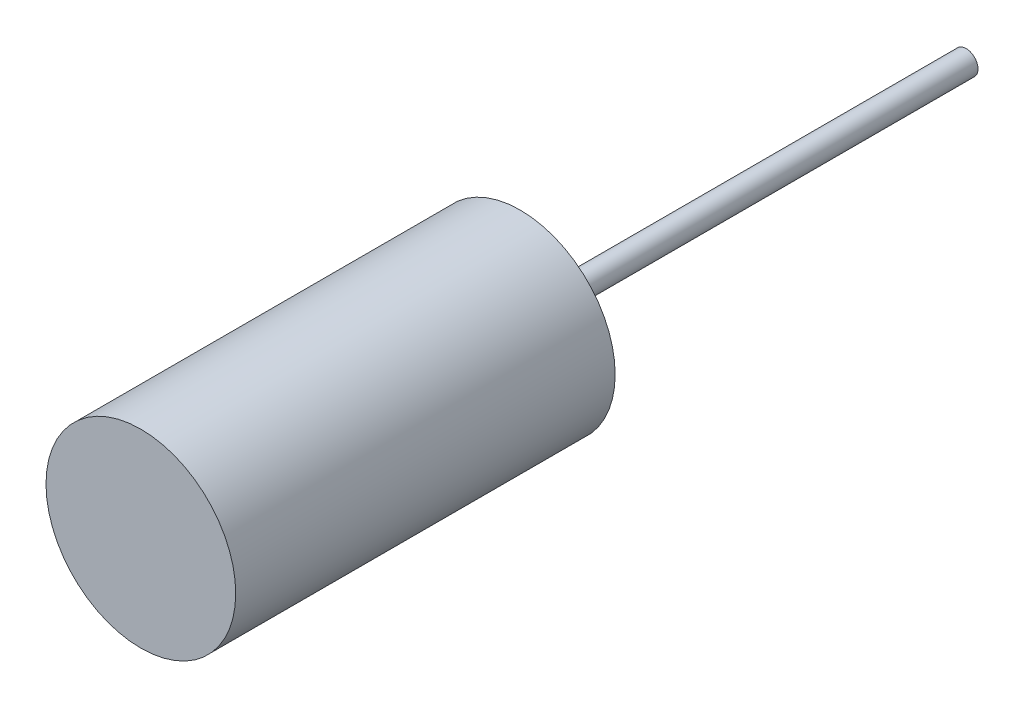
ISO-10303-21;
HEADER;
FILE_DESCRIPTION(('STEP AP214'),'2;1');
FILE_NAME('part.step','',(''),(''),'','','');
FILE_SCHEMA(('AUTOMOTIVE_DESIGN { 1 0 10303 214 1 1 1 1 }'));
ENDSEC;
DATA;
#1=APPLICATION_CONTEXT('core data for automotive mechanical design processes');
#2=APPLICATION_PROTOCOL_DEFINITION('international standard','automotive_design',2000,#1);
#3=PRODUCT_CONTEXT('',#1,'mechanical');
#4=PRODUCT('Part','Part','',(#3));
#5=PRODUCT_RELATED_PRODUCT_CATEGORY('part','',(#4));
#6=PRODUCT_DEFINITION_FORMATION('','',#4);
#7=PRODUCT_DEFINITION_CONTEXT('part definition',#1,'design');
#8=PRODUCT_DEFINITION('design','',#6,#7);
#9=PRODUCT_DEFINITION_SHAPE('','',#8);
#10=(LENGTH_UNIT() NAMED_UNIT(*) SI_UNIT(.MILLI.,.METRE.));
#11=(NAMED_UNIT(*) PLANE_ANGLE_UNIT() SI_UNIT($,.RADIAN.));
#12=(NAMED_UNIT(*) SI_UNIT($,.STERADIAN.) SOLID_ANGLE_UNIT());
#13=UNCERTAINTY_MEASURE_WITH_UNIT(LENGTH_MEASURE(1.E-05),#10,'distance_accuracy_value','');
#14=(GEOMETRIC_REPRESENTATION_CONTEXT(3) GLOBAL_UNCERTAINTY_ASSIGNED_CONTEXT((#13)) GLOBAL_UNIT_ASSIGNED_CONTEXT((#10,
#11,#12)) REPRESENTATION_CONTEXT('',''));
#15=CARTESIAN_POINT('',(0.,0.,0.));
#16=DIRECTION('',(0.,0.,1.));
#17=DIRECTION('',(1.,0.,0.));
#18=AXIS2_PLACEMENT_3D('',#15,#16,#17);
#19=CARTESIAN_POINT('',(0.,0.,50.7999999999999));
#20=DIRECTION('',(0.,0.,-0.999999999999989));
#21=DIRECTION('',(-0.999999999999996,0.,0.));
#22=AXIS2_PLACEMENT_3D('',#19,#20,#21);
#23=CYLINDRICAL_SURFACE('',#22,12.7);
#24=CARTESIAN_POINT('',(0.,0.,50.7999999999999));
#25=DIRECTION('',(0.,0.,0.999999999999989));
#26=DIRECTION('',(0.999999999999996,0.,0.));
#27=AXIS2_PLACEMENT_3D('',#24,#25,#26);
#28=CIRCLE('',#27,12.7);
#29=CARTESIAN_POINT('',(-12.6999999999999,0.,50.7999999999999));
#30=VERTEX_POINT('',#29);
#31=EDGE_CURVE('E62',#30,#30,#28,.T.);
#32=CARTESIAN_POINT('',(0.,0.,0.));
#33=DIRECTION('',(0.,0.,0.999999999999989));
#34=DIRECTION('',(0.999999999999996,0.,0.));
#35=AXIS2_PLACEMENT_3D('',#32,#33,#34);
#36=CIRCLE('',#35,12.7);
#37=CARTESIAN_POINT('',(-12.6999999999999,0.,0.));
#38=VERTEX_POINT('',#37);
#39=EDGE_CURVE('E120',#38,#38,#36,.T.);
#40=CARTESIAN_POINT('',(-12.6999999999999,0.,50.7999999999999));
#41=CARTESIAN_POINT('',(-12.6999999999999,0.,50.2708333333332));
#42=CARTESIAN_POINT('',(-12.6999999999999,0.,49.7416666666666));
#43=CARTESIAN_POINT('',(-12.6999999999999,0.,48.6833333333332));
#44=CARTESIAN_POINT('',(-12.6999999999999,0.,48.1541666666666));
#45=CARTESIAN_POINT('',(-12.6999999999999,0.,47.0958333333332));
#46=CARTESIAN_POINT('',(-12.6999999999999,0.,46.5666666666666));
#47=CARTESIAN_POINT('',(-12.6999999999999,0.,45.5083333333332));
#48=CARTESIAN_POINT('',(-12.6999999999999,0.,44.9791666666666));
#49=CARTESIAN_POINT('',(-12.6999999999999,0.,43.9208333333332));
#50=CARTESIAN_POINT('',(-12.6999999999999,0.,43.3916666666666));
#51=CARTESIAN_POINT('',(-12.6999999999999,0.,42.3333333333333));
#52=CARTESIAN_POINT('',(-12.6999999999999,0.,41.8041666666666));
#53=CARTESIAN_POINT('',(-12.6999999999999,0.,40.7458333333333));
#54=CARTESIAN_POINT('',(-12.6999999999999,0.,40.2166666666666));
#55=CARTESIAN_POINT('',(-12.6999999999999,0.,39.1583333333333));
#56=CARTESIAN_POINT('',(-12.6999999999999,0.,38.6291666666666));
#57=CARTESIAN_POINT('',(-12.6999999999999,0.,37.5708333333333));
#58=CARTESIAN_POINT('',(-12.6999999999999,0.,37.0416666666666));
#59=CARTESIAN_POINT('',(-12.6999999999999,0.,35.9833333333333));
#60=CARTESIAN_POINT('',(-12.6999999999999,0.,35.4541666666666));
#61=CARTESIAN_POINT('',(-12.6999999999999,0.,34.3958333333333));
#62=CARTESIAN_POINT('',(-12.6999999999999,0.,33.8666666666666));
#63=CARTESIAN_POINT('',(-12.6999999999999,0.,32.8083333333333));
#64=CARTESIAN_POINT('',(-12.6999999999999,0.,32.2791666666666));
#65=CARTESIAN_POINT('',(-12.6999999999999,0.,31.2208333333333));
#66=CARTESIAN_POINT('',(-12.6999999999999,0.,30.6916666666666));
#67=CARTESIAN_POINT('',(-12.6999999999999,0.,29.6333333333333));
#68=CARTESIAN_POINT('',(-12.6999999999999,0.,29.1041666666666));
#69=CARTESIAN_POINT('',(-12.6999999999999,0.,28.0458333333333));
#70=CARTESIAN_POINT('',(-12.6999999999999,0.,27.5166666666666));
#71=CARTESIAN_POINT('',(-12.6999999999999,0.,26.4583333333333));
#72=CARTESIAN_POINT('',(-12.6999999999999,0.,25.9291666666666));
#73=CARTESIAN_POINT('',(-12.6999999999999,0.,24.8708333333333));
#74=CARTESIAN_POINT('',(-12.6999999999999,0.,24.3416666666666));
#75=CARTESIAN_POINT('',(-12.6999999999999,0.,23.2833333333333));
#76=CARTESIAN_POINT('',(-12.6999999999999,0.,22.7541666666666));
#77=CARTESIAN_POINT('',(-12.6999999999999,0.,21.6958333333333));
#78=CARTESIAN_POINT('',(-12.6999999999999,0.,21.1666666666666));
#79=CARTESIAN_POINT('',(-12.6999999999999,0.,20.1083333333333));
#80=CARTESIAN_POINT('',(-12.6999999999999,0.,19.5791666666666));
#81=CARTESIAN_POINT('',(-12.6999999999999,0.,18.5208333333333));
#82=CARTESIAN_POINT('',(-12.6999999999999,0.,17.9916666666666));
#83=CARTESIAN_POINT('',(-12.6999999999999,0.,16.9333333333333));
#84=CARTESIAN_POINT('',(-12.6999999999999,0.,16.4041666666666));
#85=CARTESIAN_POINT('',(-12.6999999999999,0.,15.3458333333333));
#86=CARTESIAN_POINT('',(-12.6999999999999,0.,14.8166666666666));
#87=CARTESIAN_POINT('',(-12.6999999999999,0.,13.7583333333333));
#88=CARTESIAN_POINT('',(-12.6999999999999,0.,13.2291666666666));
#89=CARTESIAN_POINT('',(-12.6999999999999,0.,12.1708333333333));
#90=CARTESIAN_POINT('',(-12.6999999999999,0.,11.6416666666666));
#91=CARTESIAN_POINT('',(-12.6999999999999,0.,10.5833333333333));
#92=CARTESIAN_POINT('',(-12.6999999999999,0.,10.0541666666666));
#93=CARTESIAN_POINT('',(-12.6999999999999,0.,8.99583333333332));
#94=CARTESIAN_POINT('',(-12.6999999999999,0.,8.46666666666665));
#95=CARTESIAN_POINT('',(-12.6999999999999,0.,7.40833333333332));
#96=CARTESIAN_POINT('',(-12.6999999999999,0.,6.87916666666665));
#97=CARTESIAN_POINT('',(-12.6999999999999,0.,5.82083333333332));
#98=CARTESIAN_POINT('',(-12.6999999999999,0.,5.29166666666666));
#99=CARTESIAN_POINT('',(-12.6999999999999,0.,4.23333333333333));
#100=CARTESIAN_POINT('',(-12.6999999999999,0.,3.70416666666666));
#101=CARTESIAN_POINT('',(-12.6999999999999,0.,2.64583333333333));
#102=CARTESIAN_POINT('',(-12.6999999999999,0.,2.11666666666666));
#103=CARTESIAN_POINT('',(-12.6999999999999,0.,1.05833333333333));
#104=CARTESIAN_POINT('',(-12.6999999999999,0.,0.529166666666666));
#105=CARTESIAN_POINT('',(-12.6999999999999,0.,0.));
#106=B_SPLINE_CURVE_WITH_KNOTS('',3,(#40,#41,#42,#43,#44,#45,#46,#47,#48,#49,#50,#51,#52,#53,
#54,#55,#56,#57,#58,#59,#60,#61,#62,#63,#64,#65,#66,#67,#68,#69,#70,#71,#72,#73,#74,#75,#76,#77,
#78,#79,#80,#81,#82,#83,#84,#85,#86,#87,#88,#89,#90,#91,#92,#93,#94,#95,#96,#97,#98,#99,#100,
#101,#102,#103,#104,#105),.UNSPECIFIED.,.F.,.F.,(4,2,2,2,2,2,2,2,2,2,2,2,2,2,2,2,2,2,2,2,2,2,2,
2,2,2,2,2,2,2,2,2,4),(0.,1.5875,3.175,4.7625,6.34999999999999,7.93749999999999,9.52499999999998,
11.1125,12.7,14.2875,15.875,17.4625,19.05,20.6375,22.225,23.8125,25.4,26.9875,28.5749999999999,
30.1624999999999,31.7499999999999,33.3374999999999,34.9249999999999,36.5124999999999,
38.0999999999999,39.6874999999999,41.2749999999999,42.8624999999999,44.4499999999999,
46.0374999999999,47.6249999999999,49.2124999999999,50.7999999999999),.UNSPECIFIED.);
#107=EDGE_CURVE('BSEAM54',#30,#38,#106,.T.);
#108=ORIENTED_EDGE('',*,*,#31,.F.);
#109=ORIENTED_EDGE('',*,*,#39,.T.);
#110=ORIENTED_EDGE('',*,*,#107,.T.);
#111=ORIENTED_EDGE('',*,*,#107,.F.);
#112=EDGE_LOOP('',(#108,#110,#109,#111));
#113=FACE_BOUND('',#112,.T.);
#114=ADVANCED_FACE('F54',(#113),#23,.T.);
#115=CARTESIAN_POINT('',(0.,0.,50.7999999999999));
#116=DIRECTION('',(0.,0.,0.999999999999989));
#117=DIRECTION('',(0.999999999999996,0.,0.));
#118=AXIS2_PLACEMENT_3D('',#115,#116,#117);
#119=PLANE('',#118);
#120=ORIENTED_EDGE('',*,*,#31,.T.);
#121=EDGE_LOOP('',(#120));
#122=FACE_BOUND('',#121,.T.);
#123=ADVANCED_FACE('F131',(#122),#119,.T.);
#124=CARTESIAN_POINT('',(0.,0.,0.));
#125=DIRECTION('',(0.,0.,0.999999999999989));
#126=DIRECTION('',(0.999999999999996,0.,0.));
#127=AXIS2_PLACEMENT_3D('',#124,#125,#126);
#128=PLANE('',#127);
#129=CARTESIAN_POINT('',(7.61999999999997,7.62,0.));
#130=DIRECTION('',(0.,0.,-0.999999999999989));
#131=DIRECTION('',(-0.999999999999996,0.,0.));
#132=AXIS2_PLACEMENT_3D('',#129,#130,#131);
#133=CIRCLE('',#132,0.888999999999989);
#134=CARTESIAN_POINT('',(6.73099999999999,7.62,0.));
#135=VERTEX_POINT('',#134);
#136=EDGE_CURVE('E87',#135,#135,#133,.T.);
#137=ORIENTED_EDGE('',*,*,#136,.F.);
#138=EDGE_LOOP('',(#137));
#139=FACE_BOUND('',#138,.T.);
#140=CARTESIAN_POINT('',(-7.61999999999999,7.61999999999992,0.));
#141=DIRECTION('',(0.,0.,-0.999999999999989));
#142=DIRECTION('',(-0.999999999999996,0.,0.));
#143=AXIS2_PLACEMENT_3D('',#140,#141,#142);
#144=CIRCLE('',#143,0.888999999999989);
#145=CARTESIAN_POINT('',(-8.50899999999998,7.61999999999992,0.));
#146=VERTEX_POINT('',#145);
#147=EDGE_CURVE('E86',#146,#146,#144,.T.);
#148=ORIENTED_EDGE('',*,*,#147,.F.);
#149=EDGE_LOOP('',(#148));
#150=FACE_BOUND('',#149,.T.);
#151=CARTESIAN_POINT('',(-7.61999999999998,-7.61999999999997,0.));
#152=DIRECTION('',(0.,0.,-0.999999999999989));
#153=DIRECTION('',(-0.999999999999996,0.,0.));
#154=AXIS2_PLACEMENT_3D('',#151,#152,#153);
#155=CIRCLE('',#154,0.888999999999989);
#156=CARTESIAN_POINT('',(-8.50899999999997,-7.61999999999997,0.));
#157=VERTEX_POINT('',#156);
#158=EDGE_CURVE('E100',#157,#157,#155,.T.);
#159=ORIENTED_EDGE('',*,*,#158,.F.);
#160=EDGE_LOOP('',(#159));
#161=FACE_BOUND('',#160,.T.);
#162=CARTESIAN_POINT('',(7.61999999999999,-7.62000000000002,0.));
#163=DIRECTION('',(0.,0.,-0.999999999999989));
#164=DIRECTION('',(-0.999999999999996,0.,0.));
#165=AXIS2_PLACEMENT_3D('',#162,#163,#164);
#166=CIRCLE('',#165,0.888999999999989);
#167=CARTESIAN_POINT('',(6.73100000000001,-7.62000000000002,0.));
#168=VERTEX_POINT('',#167);
#169=EDGE_CURVE('E108',#168,#168,#166,.T.);
#170=ORIENTED_EDGE('',*,*,#169,.F.);
#171=EDGE_LOOP('',(#170));
#172=FACE_BOUND('',#171,.T.);
#173=CARTESIAN_POINT('',(0.,0.,0.));
#174=DIRECTION('',(0.,0.,0.999999999999989));
#175=DIRECTION('',(0.999999999999996,0.,0.));
#176=AXIS2_PLACEMENT_3D('',#173,#174,#175);
#177=CIRCLE('',#176,1.5875);
#178=CARTESIAN_POINT('',(1.58750000000003,0.,0.));
#179=VERTEX_POINT('',#178);
#180=EDGE_CURVE('E13',#179,#179,#177,.F.);
#181=ORIENTED_EDGE('',*,*,#180,.F.);
#182=EDGE_LOOP('',(#181));
#183=FACE_BOUND('',#182,.T.);
#184=ORIENTED_EDGE('',*,*,#39,.F.);
#185=EDGE_LOOP('',(#184));
#186=FACE_BOUND('',#185,.T.);
#187=ADVANCED_FACE('F128',(#139,#150,#161,#172,#183,#186),#128,.F.);
#188=CARTESIAN_POINT('',(0.,0.,-59.6899999999995));
#189=DIRECTION('',(0.,0.,0.999999999999989));
#190=DIRECTION('',(0.999999999999996,0.,0.));
#191=AXIS2_PLACEMENT_3D('',#188,#189,#190);
#192=CYLINDRICAL_SURFACE('',#191,1.5875);
#193=CARTESIAN_POINT('',(0.,0.,-59.6899999999995));
#194=DIRECTION('',(0.,0.,-0.999999999999989));
#195=DIRECTION('',(-0.999999999999996,0.,0.));
#196=AXIS2_PLACEMENT_3D('',#193,#194,#195);
#197=CIRCLE('',#196,1.5875);
#198=CARTESIAN_POINT('',(1.58750000000003,0.,-59.6899999999995));
#199=VERTEX_POINT('',#198);
#200=EDGE_CURVE('E116',#199,#199,#197,.T.);
#201=CARTESIAN_POINT('',(1.58750000000003,0.,-59.6899999999995));
#202=CARTESIAN_POINT('',(1.58750000000003,0.,-59.0682291666662));
#203=CARTESIAN_POINT('',(1.58750000000003,0.,-58.4464583333328));
#204=CARTESIAN_POINT('',(1.58750000000003,0.,-57.2029166666662));
#205=CARTESIAN_POINT('',(1.58750000000003,0.,-56.5811458333328));
#206=CARTESIAN_POINT('',(1.58750000000003,0.,-55.3376041666662));
#207=CARTESIAN_POINT('',(1.58750000000003,0.,-54.7158333333329));
#208=CARTESIAN_POINT('',(1.58750000000003,0.,-53.4722916666662));
#209=CARTESIAN_POINT('',(1.58750000000003,0.,-52.8505208333329));
#210=CARTESIAN_POINT('',(1.58750000000003,0.,-51.6069791666662));
#211=CARTESIAN_POINT('',(1.58750000000003,0.,-50.9852083333329));
#212=CARTESIAN_POINT('',(1.58750000000003,0.,-49.7416666666662));
#213=CARTESIAN_POINT('',(1.58750000000003,0.,-49.1198958333329));
#214=CARTESIAN_POINT('',(1.58750000000003,0.,-47.8763541666663));
#215=CARTESIAN_POINT('',(1.58750000000003,0.,-47.2545833333329));
#216=CARTESIAN_POINT('',(1.58750000000003,0.,-46.0110416666663));
#217=CARTESIAN_POINT('',(1.58750000000003,0.,-45.3892708333329));
#218=CARTESIAN_POINT('',(1.58750000000003,0.,-44.1457291666663));
#219=CARTESIAN_POINT('',(1.58750000000003,0.,-43.523958333333));
#220=CARTESIAN_POINT('',(1.58750000000003,0.,-42.2804166666663));
#221=CARTESIAN_POINT('',(1.58750000000003,0.,-41.658645833333));
#222=CARTESIAN_POINT('',(1.58750000000003,0.,-40.4151041666663));
#223=CARTESIAN_POINT('',(1.58750000000003,0.,-39.793333333333));
#224=CARTESIAN_POINT('',(1.58750000000003,0.,-38.5497916666663));
#225=CARTESIAN_POINT('',(1.58750000000003,0.,-37.928020833333));
#226=CARTESIAN_POINT('',(1.58750000000003,0.,-36.6844791666664));
#227=CARTESIAN_POINT('',(1.58750000000003,0.,-36.062708333333));
#228=CARTESIAN_POINT('',(1.58750000000003,0.,-34.8191666666664));
#229=CARTESIAN_POINT('',(1.58750000000003,0.,-34.197395833333));
#230=CARTESIAN_POINT('',(1.58750000000003,0.,-32.9538541666664));
#231=CARTESIAN_POINT('',(1.58750000000003,0.,-32.3320833333331));
#232=CARTESIAN_POINT('',(1.58750000000003,0.,-31.0885416666664));
#233=CARTESIAN_POINT('',(1.58750000000003,0.,-30.4667708333331));
#234=CARTESIAN_POINT('',(1.58750000000003,0.,-29.2232291666664));
#235=CARTESIAN_POINT('',(1.58750000000003,0.,-28.6014583333331));
#236=CARTESIAN_POINT('',(1.58750000000003,0.,-27.3579166666664));
#237=CARTESIAN_POINT('',(1.58750000000003,0.,-26.7361458333331));
#238=CARTESIAN_POINT('',(1.58750000000003,0.,-25.4926041666664));
#239=CARTESIAN_POINT('',(1.58750000000003,0.,-24.8708333333331));
#240=CARTESIAN_POINT('',(1.58750000000003,0.,-23.6272916666665));
#241=CARTESIAN_POINT('',(1.58750000000003,0.,-23.0055208333331));
#242=CARTESIAN_POINT('',(1.58750000000003,0.,-21.7619791666665));
#243=CARTESIAN_POINT('',(1.58750000000003,0.,-21.1402083333332));
#244=CARTESIAN_POINT('',(1.58750000000003,0.,-19.8966666666665));
#245=CARTESIAN_POINT('',(1.58750000000003,0.,-19.2748958333332));
#246=CARTESIAN_POINT('',(1.58750000000003,0.,-18.0313541666665));
#247=CARTESIAN_POINT('',(1.58750000000003,0.,-17.4095833333332));
#248=CARTESIAN_POINT('',(1.58750000000003,0.,-16.1660416666665));
#249=CARTESIAN_POINT('',(1.58750000000003,0.,-15.5442708333332));
#250=CARTESIAN_POINT('',(1.58750000000003,0.,-14.3007291666665));
#251=CARTESIAN_POINT('',(1.58750000000003,0.,-13.6789583333332));
#252=CARTESIAN_POINT('',(1.58750000000003,0.,-12.4354166666666));
#253=CARTESIAN_POINT('',(1.58750000000003,0.,-11.8136458333332));
#254=CARTESIAN_POINT('',(1.58750000000003,0.,-10.5701041666666));
#255=CARTESIAN_POINT('',(1.58750000000003,0.,-9.94833333333325));
#256=CARTESIAN_POINT('',(1.58750000000003,0.,-8.70479166666659));
#257=CARTESIAN_POINT('',(1.58750000000003,0.,-8.08302083333326));
#258=CARTESIAN_POINT('',(1.58750000000003,0.,-6.83947916666661));
#259=CARTESIAN_POINT('',(1.58750000000003,0.,-6.21770833333328));
#260=CARTESIAN_POINT('',(1.58750000000003,0.,-4.97416666666663));
#261=CARTESIAN_POINT('',(1.58750000000003,0.,-4.3523958333333));
#262=CARTESIAN_POINT('',(1.58750000000003,0.,-3.10885416666664));
#263=CARTESIAN_POINT('',(1.58750000000003,0.,-2.48708333333331));
#264=CARTESIAN_POINT('',(1.58750000000003,0.,-1.24354166666666));
#265=CARTESIAN_POINT('',(1.58750000000003,0.,-0.621770833333329));
#266=CARTESIAN_POINT('',(1.58750000000003,0.,0.));
#267=B_SPLINE_CURVE_WITH_KNOTS('',3,(#201,#202,#203,#204,#205,#206,#207,#208,#209,#210,#211,
#212,#213,#214,#215,#216,#217,#218,#219,#220,#221,#222,#223,#224,#225,#226,#227,#228,#229,#230,
#231,#232,#233,#234,#235,#236,#237,#238,#239,#240,#241,#242,#243,#244,#245,#246,#247,#248,#249,
#250,#251,#252,#253,#254,#255,#256,#257,#258,#259,#260,#261,#262,#263,#264,#265,#266),
.UNSPECIFIED.,.F.,.F.,(4,2,2,2,2,2,2,2,2,2,2,2,2,2,2,2,2,2,2,2,2,2,2,2,2,2,2,2,2,2,2,2,4),(0.,
1.86531249999999,3.73062499999997,5.59593749999995,7.46124999999994,9.32656249999993,
11.1918749999999,13.0571874999999,14.9224999999999,16.7878124999999,18.6531249999998,
20.5184374999998,22.3837499999998,24.2490624999998,26.1143749999998,27.9796874999998,
29.8449999999998,31.7103124999997,33.5756249999997,35.4409374999997,37.3062499999997,
39.1715624999997,41.0368749999997,42.9021874999996,44.7674999999996,46.6328124999996,
48.4981249999996,50.3634374999996,52.2287499999996,54.0940624999995,55.9593749999995,
57.8246874999995,59.6899999999995),.UNSPECIFIED.);
#268=EDGE_CURVE('BSEAM130',#199,#179,#267,.T.);
#269=ORIENTED_EDGE('',*,*,#200,.F.);
#270=ORIENTED_EDGE('',*,*,#180,.T.);
#271=ORIENTED_EDGE('',*,*,#268,.T.);
#272=ORIENTED_EDGE('',*,*,#268,.F.);
#273=EDGE_LOOP('',(#269,#271,#270,#272));
#274=FACE_BOUND('',#273,.T.);
#275=ADVANCED_FACE('F130',(#274),#192,.T.);
#276=CARTESIAN_POINT('',(0.,0.,-59.6899999999995));
#277=DIRECTION('',(0.,0.,-0.999999999999989));
#278=DIRECTION('',(-0.999999999999996,0.,0.));
#279=AXIS2_PLACEMENT_3D('',#276,#277,#278);
#280=PLANE('',#279);
#281=ORIENTED_EDGE('',*,*,#200,.T.);
#282=EDGE_LOOP('',(#281));
#283=FACE_BOUND('',#282,.T.);
#284=ADVANCED_FACE('F137',(#283),#280,.T.);
#285=CARTESIAN_POINT('',(7.62,-7.61999999999997,12.6999999999999));
#286=DIRECTION('',(0.,0.,-0.999999999999989));
#287=DIRECTION('',(-0.999999999999996,0.,0.));
#288=AXIS2_PLACEMENT_3D('',#285,#286,#287);
#289=CONICAL_SURFACE('',#288,0.888999999999987,1.02974425867665);
#290=CARTESIAN_POINT('',(7.62000000000001,-7.62,13.2341650903151));
#291=VERTEX_POINT('',#290);
#292=VERTEX_LOOP('',#291);
#293=FACE_BOUND('',#292,.T.);
#294=CARTESIAN_POINT('',(7.62,-7.61999999999997,12.6999999999999));
#295=DIRECTION('',(0.,0.,-0.999999999999989));
#296=DIRECTION('',(-0.999999999999996,0.,0.));
#297=AXIS2_PLACEMENT_3D('',#294,#295,#296);
#298=CIRCLE('',#297,0.888999999999987);
#299=CARTESIAN_POINT('',(6.73100000000001,-7.62000000000002,12.6999999999999));
#300=VERTEX_POINT('',#299);
#301=EDGE_CURVE('E112',#300,#300,#298,.T.);
#302=ORIENTED_EDGE('',*,*,#301,.T.);
#303=EDGE_LOOP('',(#302));
#304=FACE_BOUND('',#303,.T.);
#305=ADVANCED_FACE('F166',(#293,#304),#289,.F.);
#306=CARTESIAN_POINT('',(7.61999999999999,-7.62000000000002,0.));
#307=DIRECTION('',(0.,0.,-0.999999999999989));
#308=DIRECTION('',(-0.999999999999996,0.,0.));
#309=AXIS2_PLACEMENT_3D('',#306,#307,#308);
#310=CYLINDRICAL_SURFACE('',#309,0.888999999999988);
#311=CARTESIAN_POINT('',(6.73100000000001,-7.62000000000002,12.6999999999999));
#312=CARTESIAN_POINT('',(6.73100000000001,-7.62000000000002,12.5677083333332));
#313=CARTESIAN_POINT('',(6.73100000000001,-7.62000000000002,12.4354166666665));
#314=CARTESIAN_POINT('',(6.73100000000001,-7.62000000000002,12.1708333333332));
#315=CARTESIAN_POINT('',(6.73100000000001,-7.62000000000002,12.0385416666665));
#316=CARTESIAN_POINT('',(6.73100000000001,-7.62000000000002,11.7739583333332));
#317=CARTESIAN_POINT('',(6.73100000000001,-7.62000000000002,11.6416666666666));
#318=CARTESIAN_POINT('',(6.73100000000001,-7.62000000000002,11.3770833333332));
#319=CARTESIAN_POINT('',(6.73100000000001,-7.62000000000002,11.2447916666666));
#320=CARTESIAN_POINT('',(6.73100000000001,-7.62000000000002,10.9802083333332));
#321=CARTESIAN_POINT('',(6.73100000000001,-7.62000000000002,10.8479166666666));
#322=CARTESIAN_POINT('',(6.73100000000001,-7.62000000000002,10.5833333333332));
#323=CARTESIAN_POINT('',(6.73100000000001,-7.62000000000002,10.4510416666666));
#324=CARTESIAN_POINT('',(6.73100000000001,-7.62000000000002,10.1864583333332));
#325=CARTESIAN_POINT('',(6.73100000000001,-7.62000000000002,10.0541666666666));
#326=CARTESIAN_POINT('',(6.73100000000001,-7.62000000000002,9.78958333333324));
#327=CARTESIAN_POINT('',(6.73100000000001,-7.62000000000002,9.65729166666657));
#328=CARTESIAN_POINT('',(6.73100000000001,-7.62000000000002,9.39270833333324));
#329=CARTESIAN_POINT('',(6.73100000000001,-7.62000000000002,9.26041666666658));
#330=CARTESIAN_POINT('',(6.73100000000001,-7.62000000000002,8.99583333333324));
#331=CARTESIAN_POINT('',(6.73100000000001,-7.62000000000002,8.86354166666658));
#332=CARTESIAN_POINT('',(6.73100000000001,-7.62000000000002,8.59895833333325));
#333=CARTESIAN_POINT('',(6.73100000000001,-7.62000000000002,8.46666666666659));
#334=CARTESIAN_POINT('',(6.73100000000001,-7.62000000000002,8.20208333333325));
#335=CARTESIAN_POINT('',(6.73100000000001,-7.62000000000002,8.06979166666659));
#336=CARTESIAN_POINT('',(6.73100000000001,-7.62000000000002,7.80520833333326));
#337=CARTESIAN_POINT('',(6.73100000000001,-7.62000000000002,7.67291666666659));
#338=CARTESIAN_POINT('',(6.73100000000001,-7.62000000000002,7.40833333333326));
#339=CARTESIAN_POINT('',(6.73100000000001,-7.62000000000002,7.2760416666666));
#340=CARTESIAN_POINT('',(6.73100000000001,-7.62000000000002,7.01145833333327));
#341=CARTESIAN_POINT('',(6.73100000000001,-7.62000000000002,6.8791666666666));
#342=CARTESIAN_POINT('',(6.73100000000001,-7.62000000000002,6.61458333333327));
#343=CARTESIAN_POINT('',(6.73100000000001,-7.62000000000002,6.4822916666666));
#344=CARTESIAN_POINT('',(6.73100000000001,-7.62000000000002,6.21770833333327));
#345=CARTESIAN_POINT('',(6.73100000000001,-7.62000000000002,6.08541666666661));
#346=CARTESIAN_POINT('',(6.73100000000001,-7.62000000000002,5.82083333333328));
#347=CARTESIAN_POINT('',(6.73100000000001,-7.62000000000002,5.68854166666661));
#348=CARTESIAN_POINT('',(6.73100000000001,-7.62000000000002,5.42395833333328));
#349=CARTESIAN_POINT('',(6.73100000000001,-7.62000000000002,5.29166666666661));
#350=CARTESIAN_POINT('',(6.73100000000001,-7.62000000000002,5.02708333333328));
#351=CARTESIAN_POINT('',(6.73100000000001,-7.62000000000002,4.89479166666662));
#352=CARTESIAN_POINT('',(6.73100000000001,-7.62000000000002,4.63020833333329));
#353=CARTESIAN_POINT('',(6.73100000000001,-7.62000000000002,4.49791666666662));
#354=CARTESIAN_POINT('',(6.73100000000001,-7.62000000000002,4.23333333333329));
#355=CARTESIAN_POINT('',(6.73100000000001,-7.62000000000002,4.10104166666663));
#356=CARTESIAN_POINT('',(6.73100000000001,-7.62000000000002,3.8364583333333));
#357=CARTESIAN_POINT('',(6.73100000000001,-7.62000000000002,3.70416666666663));
#358=CARTESIAN_POINT('',(6.73100000000001,-7.62000000000002,3.4395833333333));
#359=CARTESIAN_POINT('',(6.73100000000001,-7.62000000000002,3.30729166666663));
#360=CARTESIAN_POINT('',(6.73100000000001,-7.62000000000002,3.0427083333333));
#361=CARTESIAN_POINT('',(6.73100000000001,-7.62000000000002,2.91041666666664));
#362=CARTESIAN_POINT('',(6.73100000000001,-7.62000000000002,2.64583333333331));
#363=CARTESIAN_POINT('',(6.73100000000001,-7.62000000000002,2.51354166666664));
#364=CARTESIAN_POINT('',(6.73100000000001,-7.62000000000002,2.24895833333331));
#365=CARTESIAN_POINT('',(6.73100000000001,-7.62000000000002,2.11666666666665));
#366=CARTESIAN_POINT('',(6.73100000000001,-7.62000000000002,1.85208333333332));
#367=CARTESIAN_POINT('',(6.73100000000001,-7.62000000000002,1.71979166666665));
#368=CARTESIAN_POINT('',(6.73100000000001,-7.62000000000002,1.45520833333332));
#369=CARTESIAN_POINT('',(6.73100000000001,-7.62000000000002,1.32291666666665));
#370=CARTESIAN_POINT('',(6.73100000000001,-7.62000000000002,1.05833333333332));
#371=CARTESIAN_POINT('',(6.73100000000001,-7.62000000000002,0.926041666666657));
#372=CARTESIAN_POINT('',(6.73100000000001,-7.62000000000002,0.661458333333327));
#373=CARTESIAN_POINT('',(6.73100000000001,-7.62000000000002,0.529166666666662));
#374=CARTESIAN_POINT('',(6.73100000000001,-7.62000000000002,0.264583333333331));
#375=CARTESIAN_POINT('',(6.73100000000001,-7.62000000000002,0.132291666666666));
#376=CARTESIAN_POINT('',(6.73100000000001,-7.62000000000002,0.));
#377=B_SPLINE_CURVE_WITH_KNOTS('',3,(#311,#312,#313,#314,#315,#316,#317,#318,#319,#320,#321,
#322,#323,#324,#325,#326,#327,#328,#329,#330,#331,#332,#333,#334,#335,#336,#337,#338,#339,#340,
#341,#342,#343,#344,#345,#346,#347,#348,#349,#350,#351,#352,#353,#354,#355,#356,#357,#358,#359,
#360,#361,#362,#363,#364,#365,#366,#367,#368,#369,#370,#371,#372,#373,#374,#375,#376),
.UNSPECIFIED.,.F.,.F.,(4,2,2,2,2,2,2,2,2,2,2,2,2,2,2,2,2,2,2,2,2,2,2,2,2,2,2,2,2,2,2,2,4),(0.,
0.396874999999998,0.793749999999992,1.19062499999999,1.58749999999998,1.98437499999998,
2.38124999999998,2.77812499999997,3.17499999999997,3.57187499999997,3.96874999999996,
4.36562499999996,4.76249999999995,5.15937499999995,5.55624999999995,5.95312499999994,
6.34999999999994,6.74687499999993,7.14374999999993,7.54062499999993,7.93749999999992,
8.33437499999992,8.73124999999992,9.12812499999991,9.52499999999991,9.92187499999991,
10.3187499999999,10.7156249999999,11.1124999999999,11.5093749999999,11.9062499999999,
12.3031249999999,12.6999999999999),.UNSPECIFIED.);
#378=EDGE_CURVE('BSEAM174',#300,#168,#377,.T.);
#379=ORIENTED_EDGE('',*,*,#301,.F.);
#380=ORIENTED_EDGE('',*,*,#169,.T.);
#381=ORIENTED_EDGE('',*,*,#378,.T.);
#382=ORIENTED_EDGE('',*,*,#378,.F.);
#383=EDGE_LOOP('',(#379,#381,#380,#382));
#384=FACE_BOUND('',#383,.T.);
#385=ADVANCED_FACE('F174',(#384),#310,.F.);
#386=CARTESIAN_POINT('',(-7.62,-7.62,12.6999999999999));
#387=DIRECTION('',(0.,0.,-0.999999999999989));
#388=DIRECTION('',(-0.999999999999996,0.,0.));
#389=AXIS2_PLACEMENT_3D('',#386,#387,#388);
#390=CONICAL_SURFACE('',#389,0.888999999999987,1.02974425867665);
#391=CARTESIAN_POINT('',(-7.61999999999997,-7.62,13.2341650903151));
#392=VERTEX_POINT('',#391);
#393=VERTEX_LOOP('',#392);
#394=FACE_BOUND('',#393,.T.);
#395=CARTESIAN_POINT('',(-7.62,-7.62,12.6999999999999));
#396=DIRECTION('',(0.,0.,-0.999999999999989));
#397=DIRECTION('',(-0.999999999999996,0.,0.));
#398=AXIS2_PLACEMENT_3D('',#395,#396,#397);
#399=CIRCLE('',#398,0.888999999999987);
#400=CARTESIAN_POINT('',(-8.50899999999997,-7.61999999999997,12.6999999999999));
#401=VERTEX_POINT('',#400);
#402=EDGE_CURVE('E104',#401,#401,#399,.T.);
#403=ORIENTED_EDGE('',*,*,#402,.T.);
#404=EDGE_LOOP('',(#403));
#405=FACE_BOUND('',#404,.T.);
#406=ADVANCED_FACE('F181',(#394,#405),#390,.F.);
#407=CARTESIAN_POINT('',(-7.61999999999998,-7.61999999999997,0.));
#408=DIRECTION('',(0.,0.,-0.999999999999989));
#409=DIRECTION('',(-0.999999999999996,0.,0.));
#410=AXIS2_PLACEMENT_3D('',#407,#408,#409);
#411=CYLINDRICAL_SURFACE('',#410,0.888999999999988);
#412=CARTESIAN_POINT('',(-8.50899999999997,-7.61999999999997,12.6999999999999));
#413=CARTESIAN_POINT('',(-8.50899999999997,-7.61999999999997,12.5677083333332));
#414=CARTESIAN_POINT('',(-8.50899999999997,-7.61999999999997,12.4354166666665));
#415=CARTESIAN_POINT('',(-8.50899999999997,-7.61999999999997,12.1708333333332));
#416=CARTESIAN_POINT('',(-8.50899999999997,-7.61999999999997,12.0385416666665));
#417=CARTESIAN_POINT('',(-8.50899999999997,-7.61999999999997,11.7739583333332));
#418=CARTESIAN_POINT('',(-8.50899999999997,-7.61999999999997,11.6416666666666));
#419=CARTESIAN_POINT('',(-8.50899999999997,-7.61999999999997,11.3770833333332));
#420=CARTESIAN_POINT('',(-8.50899999999997,-7.61999999999997,11.2447916666666));
#421=CARTESIAN_POINT('',(-8.50899999999997,-7.61999999999997,10.9802083333332));
#422=CARTESIAN_POINT('',(-8.50899999999997,-7.61999999999997,10.8479166666666));
#423=CARTESIAN_POINT('',(-8.50899999999997,-7.61999999999997,10.5833333333332));
#424=CARTESIAN_POINT('',(-8.50899999999997,-7.61999999999997,10.4510416666666));
#425=CARTESIAN_POINT('',(-8.50899999999997,-7.61999999999997,10.1864583333332));
#426=CARTESIAN_POINT('',(-8.50899999999997,-7.61999999999997,10.0541666666666));
#427=CARTESIAN_POINT('',(-8.50899999999997,-7.61999999999997,9.78958333333324));
#428=CARTESIAN_POINT('',(-8.50899999999997,-7.61999999999997,9.65729166666657));
#429=CARTESIAN_POINT('',(-8.50899999999997,-7.61999999999997,9.39270833333324));
#430=CARTESIAN_POINT('',(-8.50899999999997,-7.61999999999997,9.26041666666658));
#431=CARTESIAN_POINT('',(-8.50899999999997,-7.61999999999997,8.99583333333324));
#432=CARTESIAN_POINT('',(-8.50899999999997,-7.61999999999997,8.86354166666658));
#433=CARTESIAN_POINT('',(-8.50899999999997,-7.61999999999997,8.59895833333325));
#434=CARTESIAN_POINT('',(-8.50899999999997,-7.61999999999997,8.46666666666659));
#435=CARTESIAN_POINT('',(-8.50899999999997,-7.61999999999997,8.20208333333325));
#436=CARTESIAN_POINT('',(-8.50899999999997,-7.61999999999997,8.06979166666659));
#437=CARTESIAN_POINT('',(-8.50899999999997,-7.61999999999997,7.80520833333326));
#438=CARTESIAN_POINT('',(-8.50899999999997,-7.61999999999997,7.67291666666659));
#439=CARTESIAN_POINT('',(-8.50899999999997,-7.61999999999997,7.40833333333326));
#440=CARTESIAN_POINT('',(-8.50899999999997,-7.61999999999997,7.2760416666666));
#441=CARTESIAN_POINT('',(-8.50899999999997,-7.61999999999997,7.01145833333327));
#442=CARTESIAN_POINT('',(-8.50899999999997,-7.61999999999997,6.8791666666666));
#443=CARTESIAN_POINT('',(-8.50899999999997,-7.61999999999997,6.61458333333327));
#444=CARTESIAN_POINT('',(-8.50899999999997,-7.61999999999997,6.4822916666666));
#445=CARTESIAN_POINT('',(-8.50899999999997,-7.61999999999997,6.21770833333327));
#446=CARTESIAN_POINT('',(-8.50899999999997,-7.61999999999997,6.08541666666661));
#447=CARTESIAN_POINT('',(-8.50899999999997,-7.61999999999997,5.82083333333328));
#448=CARTESIAN_POINT('',(-8.50899999999997,-7.61999999999997,5.68854166666661));
#449=CARTESIAN_POINT('',(-8.50899999999997,-7.61999999999997,5.42395833333328));
#450=CARTESIAN_POINT('',(-8.50899999999997,-7.61999999999997,5.29166666666661));
#451=CARTESIAN_POINT('',(-8.50899999999997,-7.61999999999997,5.02708333333328));
#452=CARTESIAN_POINT('',(-8.50899999999997,-7.61999999999997,4.89479166666662));
#453=CARTESIAN_POINT('',(-8.50899999999997,-7.61999999999997,4.63020833333329));
#454=CARTESIAN_POINT('',(-8.50899999999997,-7.61999999999997,4.49791666666662));
#455=CARTESIAN_POINT('',(-8.50899999999997,-7.61999999999997,4.23333333333329));
#456=CARTESIAN_POINT('',(-8.50899999999997,-7.61999999999997,4.10104166666663));
#457=CARTESIAN_POINT('',(-8.50899999999997,-7.61999999999997,3.8364583333333));
#458=CARTESIAN_POINT('',(-8.50899999999997,-7.61999999999997,3.70416666666663));
#459=CARTESIAN_POINT('',(-8.50899999999997,-7.61999999999997,3.4395833333333));
#460=CARTESIAN_POINT('',(-8.50899999999997,-7.61999999999997,3.30729166666663));
#461=CARTESIAN_POINT('',(-8.50899999999997,-7.61999999999997,3.0427083333333));
#462=CARTESIAN_POINT('',(-8.50899999999997,-7.61999999999997,2.91041666666664));
#463=CARTESIAN_POINT('',(-8.50899999999997,-7.61999999999997,2.64583333333331));
#464=CARTESIAN_POINT('',(-8.50899999999997,-7.61999999999997,2.51354166666664));
#465=CARTESIAN_POINT('',(-8.50899999999997,-7.61999999999997,2.24895833333331));
#466=CARTESIAN_POINT('',(-8.50899999999997,-7.61999999999997,2.11666666666665));
#467=CARTESIAN_POINT('',(-8.50899999999997,-7.61999999999997,1.85208333333332));
#468=CARTESIAN_POINT('',(-8.50899999999997,-7.61999999999997,1.71979166666665));
#469=CARTESIAN_POINT('',(-8.50899999999997,-7.61999999999997,1.45520833333332));
#470=CARTESIAN_POINT('',(-8.50899999999997,-7.61999999999997,1.32291666666665));
#471=CARTESIAN_POINT('',(-8.50899999999997,-7.61999999999997,1.05833333333332));
#472=CARTESIAN_POINT('',(-8.50899999999997,-7.61999999999997,0.926041666666657));
#473=CARTESIAN_POINT('',(-8.50899999999997,-7.61999999999997,0.661458333333327));
#474=CARTESIAN_POINT('',(-8.50899999999997,-7.61999999999997,0.529166666666662));
#475=CARTESIAN_POINT('',(-8.50899999999997,-7.61999999999997,0.264583333333331));
#476=CARTESIAN_POINT('',(-8.50899999999997,-7.61999999999997,0.132291666666666));
#477=CARTESIAN_POINT('',(-8.50899999999997,-7.61999999999997,0.));
#478=B_SPLINE_CURVE_WITH_KNOTS('',3,(#412,#413,#414,#415,#416,#417,#418,#419,#420,#421,#422,
#423,#424,#425,#426,#427,#428,#429,#430,#431,#432,#433,#434,#435,#436,#437,#438,#439,#440,#441,
#442,#443,#444,#445,#446,#447,#448,#449,#450,#451,#452,#453,#454,#455,#456,#457,#458,#459,#460,
#461,#462,#463,#464,#465,#466,#467,#468,#469,#470,#471,#472,#473,#474,#475,#476,#477),
.UNSPECIFIED.,.F.,.F.,(4,2,2,2,2,2,2,2,2,2,2,2,2,2,2,2,2,2,2,2,2,2,2,2,2,2,2,2,2,2,2,2,4),(0.,
0.396874999999998,0.793749999999992,1.19062499999999,1.58749999999998,1.98437499999998,
2.38124999999998,2.77812499999997,3.17499999999997,3.57187499999997,3.96874999999996,
4.36562499999996,4.76249999999995,5.15937499999995,5.55624999999995,5.95312499999994,
6.34999999999994,6.74687499999993,7.14374999999993,7.54062499999993,7.93749999999992,
8.33437499999992,8.73124999999992,9.12812499999991,9.52499999999991,9.92187499999991,
10.3187499999999,10.7156249999999,11.1124999999999,11.5093749999999,11.9062499999999,
12.3031249999999,12.6999999999999),.UNSPECIFIED.);
#479=EDGE_CURVE('BSEAM189',#401,#157,#478,.T.);
#480=ORIENTED_EDGE('',*,*,#402,.F.);
#481=ORIENTED_EDGE('',*,*,#158,.T.);
#482=ORIENTED_EDGE('',*,*,#479,.T.);
#483=ORIENTED_EDGE('',*,*,#479,.F.);
#484=EDGE_LOOP('',(#480,#482,#481,#483));
#485=FACE_BOUND('',#484,.T.);
#486=ADVANCED_FACE('F189',(#485),#411,.F.);
#487=CARTESIAN_POINT('',(-7.61999999999994,7.61999999999992,12.6999999999999));
#488=DIRECTION('',(0.,0.,-0.999999999999989));
#489=DIRECTION('',(-0.999999999999996,0.,0.));
#490=AXIS2_PLACEMENT_3D('',#487,#488,#489);
#491=CONICAL_SURFACE('',#490,0.888999999999987,1.02974425867665);
#492=CARTESIAN_POINT('',(-7.61999999999994,7.61999999999992,13.2341650903151));
#493=VERTEX_POINT('',#492);
#494=VERTEX_LOOP('',#493);
#495=FACE_BOUND('',#494,.T.);
#496=CARTESIAN_POINT('',(-7.61999999999994,7.61999999999992,12.6999999999999));
#497=DIRECTION('',(0.,0.,-0.999999999999989));
#498=DIRECTION('',(-0.999999999999996,0.,0.));
#499=AXIS2_PLACEMENT_3D('',#496,#497,#498);
#500=CIRCLE('',#499,0.888999999999987);
#501=CARTESIAN_POINT('',(-8.50899999999998,7.61999999999992,12.6999999999999));
#502=VERTEX_POINT('',#501);
#503=EDGE_CURVE('E92',#502,#502,#500,.T.);
#504=ORIENTED_EDGE('',*,*,#503,.T.);
#505=EDGE_LOOP('',(#504));
#506=FACE_BOUND('',#505,.T.);
#507=ADVANCED_FACE('F196',(#495,#506),#491,.F.);
#508=CARTESIAN_POINT('',(-7.61999999999999,7.61999999999992,0.));
#509=DIRECTION('',(0.,0.,-0.999999999999989));
#510=DIRECTION('',(-0.999999999999996,0.,0.));
#511=AXIS2_PLACEMENT_3D('',#508,#509,#510);
#512=CYLINDRICAL_SURFACE('',#511,0.888999999999988);
#513=CARTESIAN_POINT('',(-8.50899999999998,7.61999999999992,12.6999999999999));
#514=CARTESIAN_POINT('',(-8.50899999999998,7.61999999999992,12.5677083333332));
#515=CARTESIAN_POINT('',(-8.50899999999998,7.61999999999992,12.4354166666665));
#516=CARTESIAN_POINT('',(-8.50899999999998,7.61999999999992,12.1708333333332));
#517=CARTESIAN_POINT('',(-8.50899999999998,7.61999999999992,12.0385416666665));
#518=CARTESIAN_POINT('',(-8.50899999999998,7.61999999999992,11.7739583333332));
#519=CARTESIAN_POINT('',(-8.50899999999998,7.61999999999992,11.6416666666666));
#520=CARTESIAN_POINT('',(-8.50899999999998,7.61999999999992,11.3770833333332));
#521=CARTESIAN_POINT('',(-8.50899999999998,7.61999999999992,11.2447916666666));
#522=CARTESIAN_POINT('',(-8.50899999999998,7.61999999999992,10.9802083333332));
#523=CARTESIAN_POINT('',(-8.50899999999998,7.61999999999992,10.8479166666666));
#524=CARTESIAN_POINT('',(-8.50899999999998,7.61999999999992,10.5833333333332));
#525=CARTESIAN_POINT('',(-8.50899999999998,7.61999999999992,10.4510416666666));
#526=CARTESIAN_POINT('',(-8.50899999999998,7.61999999999992,10.1864583333332));
#527=CARTESIAN_POINT('',(-8.50899999999998,7.61999999999992,10.0541666666666));
#528=CARTESIAN_POINT('',(-8.50899999999998,7.61999999999992,9.78958333333324));
#529=CARTESIAN_POINT('',(-8.50899999999998,7.61999999999992,9.65729166666657));
#530=CARTESIAN_POINT('',(-8.50899999999998,7.61999999999992,9.39270833333324));
#531=CARTESIAN_POINT('',(-8.50899999999998,7.61999999999992,9.26041666666658));
#532=CARTESIAN_POINT('',(-8.50899999999998,7.61999999999992,8.99583333333324));
#533=CARTESIAN_POINT('',(-8.50899999999998,7.61999999999992,8.86354166666658));
#534=CARTESIAN_POINT('',(-8.50899999999998,7.61999999999992,8.59895833333325));
#535=CARTESIAN_POINT('',(-8.50899999999998,7.61999999999992,8.46666666666659));
#536=CARTESIAN_POINT('',(-8.50899999999998,7.61999999999992,8.20208333333325));
#537=CARTESIAN_POINT('',(-8.50899999999998,7.61999999999992,8.06979166666659));
#538=CARTESIAN_POINT('',(-8.50899999999998,7.61999999999992,7.80520833333326));
#539=CARTESIAN_POINT('',(-8.50899999999998,7.61999999999992,7.67291666666659));
#540=CARTESIAN_POINT('',(-8.50899999999998,7.61999999999992,7.40833333333326));
#541=CARTESIAN_POINT('',(-8.50899999999998,7.61999999999992,7.2760416666666));
#542=CARTESIAN_POINT('',(-8.50899999999998,7.61999999999992,7.01145833333327));
#543=CARTESIAN_POINT('',(-8.50899999999998,7.61999999999992,6.8791666666666));
#544=CARTESIAN_POINT('',(-8.50899999999998,7.61999999999992,6.61458333333327));
#545=CARTESIAN_POINT('',(-8.50899999999998,7.61999999999992,6.4822916666666));
#546=CARTESIAN_POINT('',(-8.50899999999998,7.61999999999992,6.21770833333327));
#547=CARTESIAN_POINT('',(-8.50899999999998,7.61999999999992,6.08541666666661));
#548=CARTESIAN_POINT('',(-8.50899999999998,7.61999999999992,5.82083333333328));
#549=CARTESIAN_POINT('',(-8.50899999999998,7.61999999999992,5.68854166666661));
#550=CARTESIAN_POINT('',(-8.50899999999998,7.61999999999992,5.42395833333328));
#551=CARTESIAN_POINT('',(-8.50899999999998,7.61999999999992,5.29166666666661));
#552=CARTESIAN_POINT('',(-8.50899999999998,7.61999999999992,5.02708333333328));
#553=CARTESIAN_POINT('',(-8.50899999999998,7.61999999999992,4.89479166666662));
#554=CARTESIAN_POINT('',(-8.50899999999998,7.61999999999992,4.63020833333329));
#555=CARTESIAN_POINT('',(-8.50899999999998,7.61999999999992,4.49791666666662));
#556=CARTESIAN_POINT('',(-8.50899999999998,7.61999999999992,4.23333333333329));
#557=CARTESIAN_POINT('',(-8.50899999999998,7.61999999999992,4.10104166666663));
#558=CARTESIAN_POINT('',(-8.50899999999998,7.61999999999992,3.8364583333333));
#559=CARTESIAN_POINT('',(-8.50899999999998,7.61999999999992,3.70416666666663));
#560=CARTESIAN_POINT('',(-8.50899999999998,7.61999999999992,3.4395833333333));
#561=CARTESIAN_POINT('',(-8.50899999999998,7.61999999999992,3.30729166666663));
#562=CARTESIAN_POINT('',(-8.50899999999998,7.61999999999992,3.0427083333333));
#563=CARTESIAN_POINT('',(-8.50899999999998,7.61999999999992,2.91041666666664));
#564=CARTESIAN_POINT('',(-8.50899999999998,7.61999999999992,2.64583333333331));
#565=CARTESIAN_POINT('',(-8.50899999999998,7.61999999999992,2.51354166666664));
#566=CARTESIAN_POINT('',(-8.50899999999998,7.61999999999992,2.24895833333331));
#567=CARTESIAN_POINT('',(-8.50899999999998,7.61999999999992,2.11666666666665));
#568=CARTESIAN_POINT('',(-8.50899999999998,7.61999999999992,1.85208333333332));
#569=CARTESIAN_POINT('',(-8.50899999999998,7.61999999999992,1.71979166666665));
#570=CARTESIAN_POINT('',(-8.50899999999998,7.61999999999992,1.45520833333332));
#571=CARTESIAN_POINT('',(-8.50899999999998,7.61999999999992,1.32291666666665));
#572=CARTESIAN_POINT('',(-8.50899999999998,7.61999999999992,1.05833333333332));
#573=CARTESIAN_POINT('',(-8.50899999999998,7.61999999999992,0.926041666666657));
#574=CARTESIAN_POINT('',(-8.50899999999998,7.61999999999992,0.661458333333327));
#575=CARTESIAN_POINT('',(-8.50899999999998,7.61999999999992,0.529166666666662));
#576=CARTESIAN_POINT('',(-8.50899999999998,7.61999999999992,0.264583333333331));
#577=CARTESIAN_POINT('',(-8.50899999999998,7.61999999999992,0.132291666666666));
#578=CARTESIAN_POINT('',(-8.50899999999998,7.61999999999992,0.));
#579=B_SPLINE_CURVE_WITH_KNOTS('',3,(#513,#514,#515,#516,#517,#518,#519,#520,#521,#522,#523,
#524,#525,#526,#527,#528,#529,#530,#531,#532,#533,#534,#535,#536,#537,#538,#539,#540,#541,#542,
#543,#544,#545,#546,#547,#548,#549,#550,#551,#552,#553,#554,#555,#556,#557,#558,#559,#560,#561,
#562,#563,#564,#565,#566,#567,#568,#569,#570,#571,#572,#573,#574,#575,#576,#577,#578),
.UNSPECIFIED.,.F.,.F.,(4,2,2,2,2,2,2,2,2,2,2,2,2,2,2,2,2,2,2,2,2,2,2,2,2,2,2,2,2,2,2,2,4),(0.,
0.396874999999998,0.793749999999992,1.19062499999999,1.58749999999998,1.98437499999998,
2.38124999999998,2.77812499999997,3.17499999999997,3.57187499999997,3.96874999999996,
4.36562499999996,4.76249999999995,5.15937499999995,5.55624999999995,5.95312499999994,
6.34999999999994,6.74687499999993,7.14374999999993,7.54062499999993,7.93749999999992,
8.33437499999992,8.73124999999992,9.12812499999991,9.52499999999991,9.92187499999991,
10.3187499999999,10.7156249999999,11.1124999999999,11.5093749999999,11.9062499999999,
12.3031249999999,12.6999999999999),.UNSPECIFIED.);
#580=EDGE_CURVE('BSEAM79',#502,#146,#579,.T.);
#581=ORIENTED_EDGE('',*,*,#503,.F.);
#582=ORIENTED_EDGE('',*,*,#147,.T.);
#583=ORIENTED_EDGE('',*,*,#580,.T.);
#584=ORIENTED_EDGE('',*,*,#580,.F.);
#585=EDGE_LOOP('',(#581,#583,#582,#584));
#586=FACE_BOUND('',#585,.T.);
#587=ADVANCED_FACE('F79',(#586),#512,.F.);
#588=CARTESIAN_POINT('',(7.62,7.61999999999995,12.6999999999999));
#589=DIRECTION('',(0.,0.,-0.999999999999989));
#590=DIRECTION('',(-0.999999999999996,0.,0.));
#591=AXIS2_PLACEMENT_3D('',#588,#589,#590);
#592=CONICAL_SURFACE('',#591,0.888999999999987,1.02974425867665);
#593=CARTESIAN_POINT('',(7.62,7.61999999999995,13.2341650903151));
#594=VERTEX_POINT('',#593);
#595=VERTEX_LOOP('',#594);
#596=FACE_BOUND('',#595,.T.);
#597=CARTESIAN_POINT('',(7.62,7.61999999999995,12.6999999999999));
#598=DIRECTION('',(0.,0.,-0.999999999999989));
#599=DIRECTION('',(-0.999999999999996,0.,0.));
#600=AXIS2_PLACEMENT_3D('',#597,#598,#599);
#601=CIRCLE('',#600,0.888999999999987);
#602=CARTESIAN_POINT('',(6.73099999999999,7.62,12.6999999999999));
#603=VERTEX_POINT('',#602);
#604=EDGE_CURVE('E83',#603,#603,#601,.T.);
#605=ORIENTED_EDGE('',*,*,#604,.T.);
#606=EDGE_LOOP('',(#605));
#607=FACE_BOUND('',#606,.T.);
#608=ADVANCED_FACE('F75',(#596,#607),#592,.F.);
#609=CARTESIAN_POINT('',(7.61999999999997,7.62,0.));
#610=DIRECTION('',(0.,0.,-0.999999999999989));
#611=DIRECTION('',(-0.999999999999996,0.,0.));
#612=AXIS2_PLACEMENT_3D('',#609,#610,#611);
#613=CYLINDRICAL_SURFACE('',#612,0.888999999999988);
#614=CARTESIAN_POINT('',(6.73099999999999,7.62,12.6999999999999));
#615=CARTESIAN_POINT('',(6.73099999999999,7.62,12.5677083333332));
#616=CARTESIAN_POINT('',(6.73099999999999,7.62,12.4354166666665));
#617=CARTESIAN_POINT('',(6.73099999999999,7.62,12.1708333333332));
#618=CARTESIAN_POINT('',(6.73099999999999,7.62,12.0385416666665));
#619=CARTESIAN_POINT('',(6.73099999999999,7.62,11.7739583333332));
#620=CARTESIAN_POINT('',(6.73099999999999,7.62,11.6416666666666));
#621=CARTESIAN_POINT('',(6.73099999999999,7.62,11.3770833333332));
#622=CARTESIAN_POINT('',(6.73099999999999,7.62,11.2447916666666));
#623=CARTESIAN_POINT('',(6.73099999999999,7.62,10.9802083333332));
#624=CARTESIAN_POINT('',(6.73099999999999,7.62,10.8479166666666));
#625=CARTESIAN_POINT('',(6.73099999999999,7.62,10.5833333333332));
#626=CARTESIAN_POINT('',(6.73099999999999,7.62,10.4510416666666));
#627=CARTESIAN_POINT('',(6.73099999999999,7.62,10.1864583333332));
#628=CARTESIAN_POINT('',(6.73099999999999,7.62,10.0541666666666));
#629=CARTESIAN_POINT('',(6.73099999999999,7.62,9.78958333333324));
#630=CARTESIAN_POINT('',(6.73099999999999,7.62,9.65729166666657));
#631=CARTESIAN_POINT('',(6.73099999999999,7.62,9.39270833333324));
#632=CARTESIAN_POINT('',(6.73099999999999,7.62,9.26041666666658));
#633=CARTESIAN_POINT('',(6.73099999999999,7.62,8.99583333333324));
#634=CARTESIAN_POINT('',(6.73099999999999,7.62,8.86354166666658));
#635=CARTESIAN_POINT('',(6.73099999999999,7.62,8.59895833333325));
#636=CARTESIAN_POINT('',(6.73099999999999,7.62,8.46666666666659));
#637=CARTESIAN_POINT('',(6.73099999999999,7.62,8.20208333333325));
#638=CARTESIAN_POINT('',(6.73099999999999,7.62,8.06979166666659));
#639=CARTESIAN_POINT('',(6.73099999999999,7.62,7.80520833333326));
#640=CARTESIAN_POINT('',(6.73099999999999,7.62,7.67291666666659));
#641=CARTESIAN_POINT('',(6.73099999999999,7.62,7.40833333333326));
#642=CARTESIAN_POINT('',(6.73099999999999,7.62,7.2760416666666));
#643=CARTESIAN_POINT('',(6.73099999999999,7.62,7.01145833333327));
#644=CARTESIAN_POINT('',(6.73099999999999,7.62,6.8791666666666));
#645=CARTESIAN_POINT('',(6.73099999999999,7.62,6.61458333333327));
#646=CARTESIAN_POINT('',(6.73099999999999,7.62,6.4822916666666));
#647=CARTESIAN_POINT('',(6.73099999999999,7.62,6.21770833333327));
#648=CARTESIAN_POINT('',(6.73099999999999,7.62,6.08541666666661));
#649=CARTESIAN_POINT('',(6.73099999999999,7.62,5.82083333333328));
#650=CARTESIAN_POINT('',(6.73099999999999,7.62,5.68854166666661));
#651=CARTESIAN_POINT('',(6.73099999999999,7.62,5.42395833333328));
#652=CARTESIAN_POINT('',(6.73099999999999,7.62,5.29166666666661));
#653=CARTESIAN_POINT('',(6.73099999999999,7.62,5.02708333333328));
#654=CARTESIAN_POINT('',(6.73099999999999,7.62,4.89479166666662));
#655=CARTESIAN_POINT('',(6.73099999999999,7.62,4.63020833333329));
#656=CARTESIAN_POINT('',(6.73099999999999,7.62,4.49791666666662));
#657=CARTESIAN_POINT('',(6.73099999999999,7.62,4.23333333333329));
#658=CARTESIAN_POINT('',(6.73099999999999,7.62,4.10104166666663));
#659=CARTESIAN_POINT('',(6.73099999999999,7.62,3.8364583333333));
#660=CARTESIAN_POINT('',(6.73099999999999,7.62,3.70416666666663));
#661=CARTESIAN_POINT('',(6.73099999999999,7.62,3.4395833333333));
#662=CARTESIAN_POINT('',(6.73099999999999,7.62,3.30729166666663));
#663=CARTESIAN_POINT('',(6.73099999999999,7.62,3.0427083333333));
#664=CARTESIAN_POINT('',(6.73099999999999,7.62,2.91041666666664));
#665=CARTESIAN_POINT('',(6.73099999999999,7.62,2.64583333333331));
#666=CARTESIAN_POINT('',(6.73099999999999,7.62,2.51354166666664));
#667=CARTESIAN_POINT('',(6.73099999999999,7.62,2.24895833333331));
#668=CARTESIAN_POINT('',(6.73099999999999,7.62,2.11666666666665));
#669=CARTESIAN_POINT('',(6.73099999999999,7.62,1.85208333333332));
#670=CARTESIAN_POINT('',(6.73099999999999,7.62,1.71979166666665));
#671=CARTESIAN_POINT('',(6.73099999999999,7.62,1.45520833333332));
#672=CARTESIAN_POINT('',(6.73099999999999,7.62,1.32291666666665));
#673=CARTESIAN_POINT('',(6.73099999999999,7.62,1.05833333333332));
#674=CARTESIAN_POINT('',(6.73099999999999,7.62,0.926041666666657));
#675=CARTESIAN_POINT('',(6.73099999999999,7.62,0.661458333333327));
#676=CARTESIAN_POINT('',(6.73099999999999,7.62,0.529166666666662));
#677=CARTESIAN_POINT('',(6.73099999999999,7.62,0.264583333333331));
#678=CARTESIAN_POINT('',(6.73099999999999,7.62,0.132291666666666));
#679=CARTESIAN_POINT('',(6.73099999999999,7.62,0.));
#680=B_SPLINE_CURVE_WITH_KNOTS('',3,(#614,#615,#616,#617,#618,#619,#620,#621,#622,#623,#624,
#625,#626,#627,#628,#629,#630,#631,#632,#633,#634,#635,#636,#637,#638,#639,#640,#641,#642,#643,
#644,#645,#646,#647,#648,#649,#650,#651,#652,#653,#654,#655,#656,#657,#658,#659,#660,#661,#662,
#663,#664,#665,#666,#667,#668,#669,#670,#671,#672,#673,#674,#675,#676,#677,#678,#679),
.UNSPECIFIED.,.F.,.F.,(4,2,2,2,2,2,2,2,2,2,2,2,2,2,2,2,2,2,2,2,2,2,2,2,2,2,2,2,2,2,2,2,4),(0.,
0.396874999999998,0.793749999999992,1.19062499999999,1.58749999999998,1.98437499999998,
2.38124999999998,2.77812499999997,3.17499999999997,3.57187499999997,3.96874999999996,
4.36562499999996,4.76249999999995,5.15937499999995,5.55624999999995,5.95312499999994,
6.34999999999994,6.74687499999993,7.14374999999993,7.54062499999993,7.93749999999992,
8.33437499999992,8.73124999999992,9.12812499999991,9.52499999999991,9.92187499999991,
10.3187499999999,10.7156249999999,11.1124999999999,11.5093749999999,11.9062499999999,
12.3031249999999,12.6999999999999),.UNSPECIFIED.);
#681=EDGE_CURVE('BSEAM78',#603,#135,#680,.T.);
#682=ORIENTED_EDGE('',*,*,#604,.F.);
#683=ORIENTED_EDGE('',*,*,#136,.T.);
#684=ORIENTED_EDGE('',*,*,#681,.T.);
#685=ORIENTED_EDGE('',*,*,#681,.F.);
#686=EDGE_LOOP('',(#682,#684,#683,#685));
#687=FACE_BOUND('',#686,.T.);
#688=ADVANCED_FACE('F78',(#687),#613,.F.);
#689=CLOSED_SHELL('',(#114,#123,#187,#275,#284,#305,#385,#406,#486,#507,#587,#608,#688));
#690=MANIFOLD_SOLID_BREP('B2',#689);
#691=ADVANCED_BREP_SHAPE_REPRESENTATION('',(#18,#690),#14);
#692=SHAPE_DEFINITION_REPRESENTATION(#9,#691);
ENDSEC;
END-ISO-10303-21;
